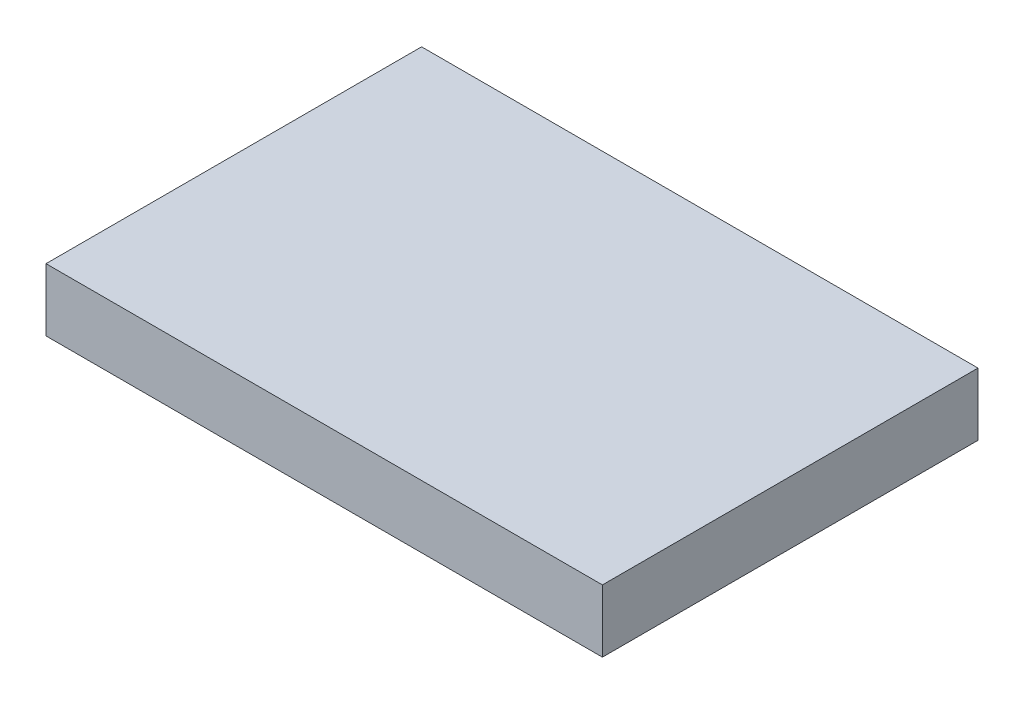
ISO-10303-21;
HEADER;
FILE_DESCRIPTION(('STEP AP214'),'2;1');
FILE_NAME('part.step','',(''),(''),'','','');
FILE_SCHEMA(('AUTOMOTIVE_DESIGN { 1 0 10303 214 1 1 1 1 }'));
ENDSEC;
DATA;
#1=APPLICATION_CONTEXT('core data for automotive mechanical design processes');
#2=APPLICATION_PROTOCOL_DEFINITION('international standard','automotive_design',2000,#1);
#3=PRODUCT_CONTEXT('',#1,'mechanical');
#4=PRODUCT('Part','Part','',(#3));
#5=PRODUCT_RELATED_PRODUCT_CATEGORY('part','',(#4));
#6=PRODUCT_DEFINITION_FORMATION('','',#4);
#7=PRODUCT_DEFINITION_CONTEXT('part definition',#1,'design');
#8=PRODUCT_DEFINITION('design','',#6,#7);
#9=PRODUCT_DEFINITION_SHAPE('','',#8);
#10=(LENGTH_UNIT() NAMED_UNIT(*) SI_UNIT(.MILLI.,.METRE.));
#11=(NAMED_UNIT(*) PLANE_ANGLE_UNIT() SI_UNIT($,.RADIAN.));
#12=(NAMED_UNIT(*) SI_UNIT($,.STERADIAN.) SOLID_ANGLE_UNIT());
#13=UNCERTAINTY_MEASURE_WITH_UNIT(LENGTH_MEASURE(1.E-05),#10,'distance_accuracy_value','');
#14=(GEOMETRIC_REPRESENTATION_CONTEXT(3) GLOBAL_UNCERTAINTY_ASSIGNED_CONTEXT((#13)) GLOBAL_UNIT_ASSIGNED_CONTEXT((#10,
#11,#12)) REPRESENTATION_CONTEXT('',''));
#15=CARTESIAN_POINT('',(0.,0.,0.));
#16=DIRECTION('',(0.,0.,1.));
#17=DIRECTION('',(1.,0.,0.));
#18=AXIS2_PLACEMENT_3D('',#15,#16,#17);
#19=CARTESIAN_POINT('',(0.,-9.,-27.));
#20=DIRECTION('',(0.,0.,-1.));
#21=DIRECTION('',(-1.,0.,0.));
#22=AXIS2_PLACEMENT_3D('',#19,#20,#21);
#23=PLANE('',#22);
#24=DIRECTION('',(-1.,0.,0.));
#25=VECTOR('',#24,1.);
#26=CARTESIAN_POINT('',(0.,0.,-27.));
#27=LINE('',#26,#25);
#28=CARTESIAN_POINT('',(40.,0.,-27.));
#29=VERTEX_POINT('',#28);
#30=CARTESIAN_POINT('',(-40.,0.,-27.));
#31=VERTEX_POINT('',#30);
#32=EDGE_CURVE('E102',#29,#31,#27,.T.);
#33=ORIENTED_EDGE('',*,*,#32,.F.);
#34=DIRECTION('',(0.,1.,0.));
#35=VECTOR('',#34,1.);
#36=CARTESIAN_POINT('',(40.,-9.,-27.));
#37=LINE('',#36,#35);
#38=CARTESIAN_POINT('',(40.,-9.,-27.));
#39=VERTEX_POINT('',#38);
#40=EDGE_CURVE('E11',#39,#29,#37,.T.);
#41=ORIENTED_EDGE('',*,*,#40,.F.);
#42=DIRECTION('',(-1.,0.,0.));
#43=VECTOR('',#42,1.);
#44=CARTESIAN_POINT('',(0.,-9.,-27.));
#45=LINE('',#44,#43);
#46=CARTESIAN_POINT('',(-40.,-9.,-27.));
#47=VERTEX_POINT('',#46);
#48=EDGE_CURVE('E96',#39,#47,#45,.T.);
#49=ORIENTED_EDGE('',*,*,#48,.T.);
#50=DIRECTION('',(0.,1.,0.));
#51=VECTOR('',#50,1.);
#52=CARTESIAN_POINT('',(-40.,-9.,-27.));
#53=LINE('',#52,#51);
#54=EDGE_CURVE('E41',#47,#31,#53,.T.);
#55=ORIENTED_EDGE('',*,*,#54,.T.);
#56=EDGE_LOOP('',(#33,#41,#49,#55));
#57=FACE_BOUND('',#56,.T.);
#58=ADVANCED_FACE('F38',(#57),#23,.T.);
#59=CARTESIAN_POINT('',(40.,-9.,0.));
#60=DIRECTION('',(1.,0.,0.));
#61=DIRECTION('',(0.,0.,-1.));
#62=AXIS2_PLACEMENT_3D('',#59,#60,#61);
#63=PLANE('',#62);
#64=DIRECTION('',(0.,0.,-1.));
#65=VECTOR('',#64,1.);
#66=CARTESIAN_POINT('',(40.,0.,0.));
#67=LINE('',#66,#65);
#68=CARTESIAN_POINT('',(40.,0.,27.));
#69=VERTEX_POINT('',#68);
#70=EDGE_CURVE('E98',#69,#29,#67,.T.);
#71=ORIENTED_EDGE('',*,*,#70,.F.);
#72=DIRECTION('',(0.,1.,0.));
#73=VECTOR('',#72,1.);
#74=CARTESIAN_POINT('',(40.,-9.,27.));
#75=LINE('',#74,#73);
#76=CARTESIAN_POINT('',(40.,-9.,27.));
#77=VERTEX_POINT('',#76);
#78=EDGE_CURVE('E47',#77,#69,#75,.T.);
#79=ORIENTED_EDGE('',*,*,#78,.F.);
#80=DIRECTION('',(0.,0.,-1.));
#81=VECTOR('',#80,1.);
#82=CARTESIAN_POINT('',(40.,-9.,0.));
#83=LINE('',#82,#81);
#84=EDGE_CURVE('E86',#77,#39,#83,.T.);
#85=ORIENTED_EDGE('',*,*,#84,.T.);
#86=ORIENTED_EDGE('',*,*,#40,.T.);
#87=EDGE_LOOP('',(#71,#79,#85,#86));
#88=FACE_BOUND('',#87,.T.);
#89=ADVANCED_FACE('F112',(#88),#63,.T.);
#90=CARTESIAN_POINT('',(0.,-9.,27.));
#91=DIRECTION('',(0.,0.,-1.));
#92=DIRECTION('',(-1.,0.,0.));
#93=AXIS2_PLACEMENT_3D('',#90,#91,#92);
#94=PLANE('',#93);
#95=DIRECTION('',(-1.,0.,0.));
#96=VECTOR('',#95,1.);
#97=CARTESIAN_POINT('',(0.,0.,27.));
#98=LINE('',#97,#96);
#99=CARTESIAN_POINT('',(-40.,0.,27.));
#100=VERTEX_POINT('',#99);
#101=EDGE_CURVE('E91',#69,#100,#98,.T.);
#102=ORIENTED_EDGE('',*,*,#101,.T.);
#103=DIRECTION('',(0.,1.,0.));
#104=VECTOR('',#103,1.);
#105=CARTESIAN_POINT('',(-40.,-9.,27.));
#106=LINE('',#105,#104);
#107=CARTESIAN_POINT('',(-40.,-9.,27.));
#108=VERTEX_POINT('',#107);
#109=EDGE_CURVE('E89',#108,#100,#106,.T.);
#110=ORIENTED_EDGE('',*,*,#109,.F.);
#111=DIRECTION('',(-1.,0.,0.));
#112=VECTOR('',#111,1.);
#113=CARTESIAN_POINT('',(0.,-9.,27.));
#114=LINE('',#113,#112);
#115=EDGE_CURVE('E83',#77,#108,#114,.T.);
#116=ORIENTED_EDGE('',*,*,#115,.F.);
#117=ORIENTED_EDGE('',*,*,#78,.T.);
#118=EDGE_LOOP('',(#102,#110,#116,#117));
#119=FACE_BOUND('',#118,.T.);
#120=ADVANCED_FACE('F90',(#119),#94,.F.);
#121=CARTESIAN_POINT('',(-40.,-9.,0.));
#122=DIRECTION('',(1.,0.,0.));
#123=DIRECTION('',(0.,0.,-1.));
#124=AXIS2_PLACEMENT_3D('',#121,#122,#123);
#125=PLANE('',#124);
#126=DIRECTION('',(0.,0.,-1.));
#127=VECTOR('',#126,1.);
#128=CARTESIAN_POINT('',(-40.,0.,0.));
#129=LINE('',#128,#127);
#130=EDGE_CURVE('E105',#100,#31,#129,.T.);
#131=ORIENTED_EDGE('',*,*,#130,.T.);
#132=ORIENTED_EDGE('',*,*,#54,.F.);
#133=DIRECTION('',(0.,0.,-1.));
#134=VECTOR('',#133,1.);
#135=CARTESIAN_POINT('',(-40.,-9.,0.));
#136=LINE('',#135,#134);
#137=EDGE_CURVE('E80',#108,#47,#136,.T.);
#138=ORIENTED_EDGE('',*,*,#137,.F.);
#139=ORIENTED_EDGE('',*,*,#109,.T.);
#140=EDGE_LOOP('',(#131,#132,#138,#139));
#141=FACE_BOUND('',#140,.T.);
#142=ADVANCED_FACE('F95',(#141),#125,.F.);
#143=CARTESIAN_POINT('',(0.,-9.,0.));
#144=DIRECTION('',(0.,1.,0.));
#145=DIRECTION('',(0.,0.,1.));
#146=AXIS2_PLACEMENT_3D('',#143,#144,#145);
#147=PLANE('',#146);
#148=ORIENTED_EDGE('',*,*,#48,.F.);
#149=ORIENTED_EDGE('',*,*,#84,.F.);
#150=ORIENTED_EDGE('',*,*,#115,.T.);
#151=ORIENTED_EDGE('',*,*,#137,.T.);
#152=EDGE_LOOP('',(#148,#149,#150,#151));
#153=FACE_BOUND('',#152,.T.);
#154=ADVANCED_FACE('F85',(#153),#147,.F.);
#155=CARTESIAN_POINT('',(0.,0.,0.));
#156=DIRECTION('',(0.,1.,0.));
#157=DIRECTION('',(0.,0.,1.));
#158=AXIS2_PLACEMENT_3D('',#155,#156,#157);
#159=PLANE('',#158);
#160=ORIENTED_EDGE('',*,*,#32,.T.);
#161=ORIENTED_EDGE('',*,*,#130,.F.);
#162=ORIENTED_EDGE('',*,*,#101,.F.);
#163=ORIENTED_EDGE('',*,*,#70,.T.);
#164=EDGE_LOOP('',(#160,#161,#162,#163));
#165=FACE_BOUND('',#164,.T.);
#166=ADVANCED_FACE('F111',(#165),#159,.T.);
#167=CLOSED_SHELL('',(#58,#89,#120,#142,#154,#166));
#168=MANIFOLD_SOLID_BREP('B2',#167);
#169=ADVANCED_BREP_SHAPE_REPRESENTATION('',(#18,#168),#14);
#170=SHAPE_DEFINITION_REPRESENTATION(#9,#169);
ENDSEC;
END-ISO-10303-21;
